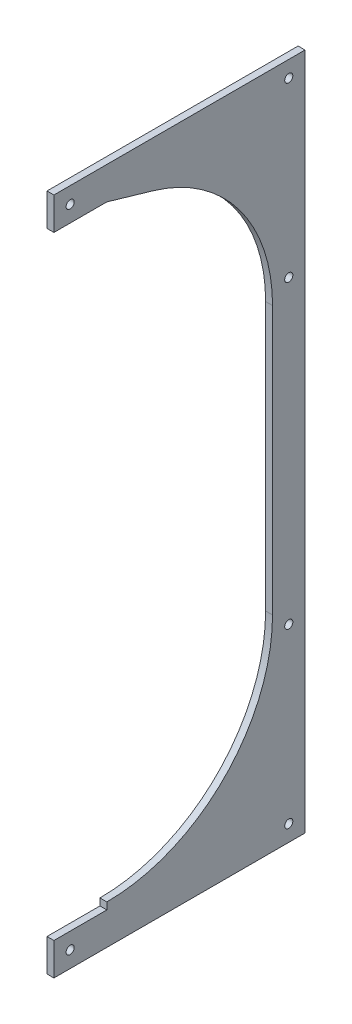
ISO-10303-21;
HEADER;
FILE_DESCRIPTION(('STEP AP214'),'2;1');
FILE_NAME('part.step','',(''),(''),'','','');
FILE_SCHEMA(('AUTOMOTIVE_DESIGN { 1 0 10303 214 1 1 1 1 }'));
ENDSEC;
DATA;
#1=APPLICATION_CONTEXT('core data for automotive mechanical design processes');
#2=APPLICATION_PROTOCOL_DEFINITION('international standard','automotive_design',2000,#1);
#3=PRODUCT_CONTEXT('',#1,'mechanical');
#4=PRODUCT('Part','Part','',(#3));
#5=PRODUCT_RELATED_PRODUCT_CATEGORY('part','',(#4));
#6=PRODUCT_DEFINITION_FORMATION('','',#4);
#7=PRODUCT_DEFINITION_CONTEXT('part definition',#1,'design');
#8=PRODUCT_DEFINITION('design','',#6,#7);
#9=PRODUCT_DEFINITION_SHAPE('','',#8);
#10=(LENGTH_UNIT() NAMED_UNIT(*) SI_UNIT(.MILLI.,.METRE.));
#11=(NAMED_UNIT(*) PLANE_ANGLE_UNIT() SI_UNIT($,.RADIAN.));
#12=(NAMED_UNIT(*) SI_UNIT($,.STERADIAN.) SOLID_ANGLE_UNIT());
#13=UNCERTAINTY_MEASURE_WITH_UNIT(LENGTH_MEASURE(1.E-05),#10,'distance_accuracy_value','');
#14=(GEOMETRIC_REPRESENTATION_CONTEXT(3) GLOBAL_UNCERTAINTY_ASSIGNED_CONTEXT((#13)) GLOBAL_UNIT_ASSIGNED_CONTEXT((#10,
#11,#12)) REPRESENTATION_CONTEXT('',''));
#15=CARTESIAN_POINT('',(0.,0.,0.));
#16=DIRECTION('',(0.,0.,1.));
#17=DIRECTION('',(1.,0.,0.));
#18=AXIS2_PLACEMENT_3D('',#15,#16,#17);
#19=CARTESIAN_POINT('',(5.4102,0.,-154.94));
#20=DIRECTION('',(0.,0.,1.));
#21=DIRECTION('',(1.,0.,0.));
#22=AXIS2_PLACEMENT_3D('',#19,#20,#21);
#23=PLANE('',#22);
#24=DIRECTION('',(0.,1.,0.));
#25=VECTOR('',#24,1.);
#26=CARTESIAN_POINT('',(0.,0.,-154.94));
#27=LINE('',#26,#25);
#28=CARTESIAN_POINT('',(0.,-160.3502,-154.94));
#29=VERTEX_POINT('',#28);
#30=CARTESIAN_POINT('',(0.,369.88496,-154.94));
#31=VERTEX_POINT('',#30);
#32=EDGE_CURVE('E169',#29,#31,#27,.T.);
#33=ORIENTED_EDGE('',*,*,#32,.T.);
#34=DIRECTION('',(-1.,0.,0.));
#35=VECTOR('',#34,1.);
#36=CARTESIAN_POINT('',(5.4102,369.88496,-154.94));
#37=LINE('',#36,#35);
#38=CARTESIAN_POINT('',(5.4102,369.88496,-154.94));
#39=VERTEX_POINT('',#38);
#40=EDGE_CURVE('E11',#39,#31,#37,.T.);
#41=ORIENTED_EDGE('',*,*,#40,.F.);
#42=DIRECTION('',(0.,1.,0.));
#43=VECTOR('',#42,1.);
#44=CARTESIAN_POINT('',(5.4102,0.,-154.94));
#45=LINE('',#44,#43);
#46=CARTESIAN_POINT('',(5.4102,-160.3502,-154.94));
#47=VERTEX_POINT('',#46);
#48=EDGE_CURVE('E97',#47,#39,#45,.T.);
#49=ORIENTED_EDGE('',*,*,#48,.F.);
#50=DIRECTION('',(-1.,0.,0.));
#51=VECTOR('',#50,1.);
#52=CARTESIAN_POINT('',(5.4102,-160.3502,-154.94));
#53=LINE('',#52,#51);
#54=EDGE_CURVE('E168',#47,#29,#53,.T.);
#55=ORIENTED_EDGE('',*,*,#54,.T.);
#56=EDGE_LOOP('',(#33,#41,#49,#55));
#57=FACE_BOUND('',#56,.T.);
#58=ADVANCED_FACE('F35',(#57),#23,.F.);
#59=CARTESIAN_POINT('',(5.4102,369.88496,0.));
#60=DIRECTION('',(0.,1.,0.));
#61=DIRECTION('',(0.,0.,1.));
#62=AXIS2_PLACEMENT_3D('',#59,#60,#61);
#63=PLANE('',#62);
#64=DIRECTION('',(0.,0.,-1.));
#65=VECTOR('',#64,1.);
#66=CARTESIAN_POINT('',(0.,369.88496,0.));
#67=LINE('',#66,#65);
#68=CARTESIAN_POINT('',(0.,369.88496,41.402));
#69=VERTEX_POINT('',#68);
#70=EDGE_CURVE('E172',#69,#31,#67,.T.);
#71=ORIENTED_EDGE('',*,*,#70,.F.);
#72=DIRECTION('',(-1.,0.,0.));
#73=VECTOR('',#72,1.);
#74=CARTESIAN_POINT('',(5.4102,369.88496,41.402));
#75=LINE('',#74,#73);
#76=CARTESIAN_POINT('',(5.4102,369.88496,41.402));
#77=VERTEX_POINT('',#76);
#78=EDGE_CURVE('E43',#77,#69,#75,.T.);
#79=ORIENTED_EDGE('',*,*,#78,.F.);
#80=DIRECTION('',(0.,0.,-1.));
#81=VECTOR('',#80,1.);
#82=CARTESIAN_POINT('',(5.4102,369.88496,0.));
#83=LINE('',#82,#81);
#84=EDGE_CURVE('E244',#77,#39,#83,.T.);
#85=ORIENTED_EDGE('',*,*,#84,.T.);
#86=ORIENTED_EDGE('',*,*,#40,.T.);
#87=EDGE_LOOP('',(#71,#79,#85,#86));
#88=FACE_BOUND('',#87,.T.);
#89=ADVANCED_FACE('F243',(#88),#63,.T.);
#90=CARTESIAN_POINT('',(5.4102,0.,41.402));
#91=DIRECTION('',(0.,0.,-1.));
#92=DIRECTION('',(-1.,0.,0.));
#93=AXIS2_PLACEMENT_3D('',#90,#91,#92);
#94=PLANE('',#93);
#95=DIRECTION('',(0.,-1.,0.));
#96=VECTOR('',#95,1.);
#97=CARTESIAN_POINT('',(0.,0.,41.402));
#98=LINE('',#97,#96);
#99=CARTESIAN_POINT('',(0.,344.48496,41.402));
#100=VERTEX_POINT('',#99);
#101=EDGE_CURVE('E176',#69,#100,#98,.T.);
#102=ORIENTED_EDGE('',*,*,#101,.T.);
#103=DIRECTION('',(-1.,0.,0.));
#104=VECTOR('',#103,1.);
#105=CARTESIAN_POINT('',(5.4102,344.48496,41.402));
#106=LINE('',#105,#104);
#107=CARTESIAN_POINT('',(5.4102,344.48496,41.402));
#108=VERTEX_POINT('',#107);
#109=EDGE_CURVE('E226',#108,#100,#106,.T.);
#110=ORIENTED_EDGE('',*,*,#109,.F.);
#111=DIRECTION('',(0.,-1.,0.));
#112=VECTOR('',#111,1.);
#113=CARTESIAN_POINT('',(5.4102,0.,41.402));
#114=LINE('',#113,#112);
#115=EDGE_CURVE('E232',#77,#108,#114,.T.);
#116=ORIENTED_EDGE('',*,*,#115,.F.);
#117=ORIENTED_EDGE('',*,*,#78,.T.);
#118=EDGE_LOOP('',(#102,#110,#116,#117));
#119=FACE_BOUND('',#118,.T.);
#120=ADVANCED_FACE('F230',(#119),#94,.F.);
#121=CARTESIAN_POINT('',(5.4102,344.48496,0.));
#122=DIRECTION('',(0.,-1.,0.));
#123=DIRECTION('',(0.,0.,-1.));
#124=AXIS2_PLACEMENT_3D('',#121,#122,#123);
#125=PLANE('',#124);
#126=DIRECTION('',(0.,0.,1.));
#127=VECTOR('',#126,1.);
#128=CARTESIAN_POINT('',(0.,344.48496,0.));
#129=LINE('',#128,#127);
#130=CARTESIAN_POINT('',(0.,344.48496,0.));
#131=VERTEX_POINT('',#130);
#132=EDGE_CURVE('E179',#131,#100,#129,.T.);
#133=ORIENTED_EDGE('',*,*,#132,.F.);
#134=DIRECTION('',(-1.,0.,0.));
#135=VECTOR('',#134,1.);
#136=CARTESIAN_POINT('',(5.4102,344.48496,0.));
#137=LINE('',#136,#135);
#138=CARTESIAN_POINT('',(5.4102,344.48496,0.));
#139=VERTEX_POINT('',#138);
#140=EDGE_CURVE('E224',#139,#131,#137,.T.);
#141=ORIENTED_EDGE('',*,*,#140,.F.);
#142=DIRECTION('',(0.,0.,1.));
#143=VECTOR('',#142,1.);
#144=CARTESIAN_POINT('',(5.4102,344.48496,0.));
#145=LINE('',#144,#143);
#146=EDGE_CURVE('E279',#139,#108,#145,.T.);
#147=ORIENTED_EDGE('',*,*,#146,.T.);
#148=ORIENTED_EDGE('',*,*,#109,.T.);
#149=EDGE_LOOP('',(#133,#141,#147,#148));
#150=FACE_BOUND('',#149,.T.);
#151=ADVANCED_FACE('F289',(#150),#125,.T.);
#152=CARTESIAN_POINT('',(5.4102,209.53476,0.));
#153=DIRECTION('',(-1.,0.,0.));
#154=DIRECTION('',(0.,0.,1.));
#155=AXIS2_PLACEMENT_3D('',#152,#153,#154);
#156=CYLINDRICAL_SURFACE('',#155,129.54);
#157=CARTESIAN_POINT('',(5.4102,209.53476,0.));
#158=DIRECTION('',(1.,0.,0.));
#159=DIRECTION('',(0.,0.,-1.));
#160=AXIS2_PLACEMENT_3D('',#157,#158,#159);
#161=CIRCLE('',#160,129.54);
#162=CARTESIAN_POINT('',(5.4102,333.881462825265,-36.3112805679615));
#163=VERTEX_POINT('',#162);
#164=CARTESIAN_POINT('',(5.4102,209.53476,-129.54));
#165=VERTEX_POINT('',#164);
#166=EDGE_CURVE('E268',#163,#165,#161,.F.);
#167=ORIENTED_EDGE('',*,*,#166,.F.);
#168=DIRECTION('',(1.,0.,0.));
#169=VECTOR('',#168,1.);
#170=CARTESIAN_POINT('',(0.,333.881462825265,-36.3112805679615));
#171=LINE('',#170,#169);
#172=CARTESIAN_POINT('',(0.,333.881462825265,-36.3112805679615));
#173=VERTEX_POINT('',#172);
#174=EDGE_CURVE('E173',#173,#163,#171,.T.);
#175=ORIENTED_EDGE('',*,*,#174,.F.);
#176=CARTESIAN_POINT('',(0.,209.53476,0.));
#177=DIRECTION('',(1.,0.,0.));
#178=DIRECTION('',(0.,0.,-1.));
#179=AXIS2_PLACEMENT_3D('',#176,#177,#178);
#180=CIRCLE('',#179,129.54);
#181=CARTESIAN_POINT('',(0.,209.53476,-129.54));
#182=VERTEX_POINT('',#181);
#183=EDGE_CURVE('E182',#173,#182,#180,.F.);
#184=ORIENTED_EDGE('',*,*,#183,.T.);
#185=DIRECTION('',(-1.,0.,0.));
#186=VECTOR('',#185,1.);
#187=CARTESIAN_POINT('',(5.4102,209.53476,-129.54));
#188=LINE('',#187,#186);
#189=EDGE_CURVE('E221',#165,#182,#188,.T.);
#190=ORIENTED_EDGE('',*,*,#189,.F.);
#191=EDGE_LOOP('',(#167,#175,#184,#190));
#192=FACE_BOUND('',#191,.T.);
#193=ADVANCED_FACE('F265',(#192),#156,.F.);
#194=CARTESIAN_POINT('',(5.4102,0.,-129.54));
#195=DIRECTION('',(0.,0.,-1.));
#196=DIRECTION('',(-1.,0.,0.));
#197=AXIS2_PLACEMENT_3D('',#194,#195,#196);
#198=PLANE('',#197);
#199=DIRECTION('',(0.,-1.,0.));
#200=VECTOR('',#199,1.);
#201=CARTESIAN_POINT('',(0.,0.,-129.54));
#202=LINE('',#201,#200);
#203=CARTESIAN_POINT('',(0.,0.,-129.54));
#204=VERTEX_POINT('',#203);
#205=EDGE_CURVE('E184',#182,#204,#202,.T.);
#206=ORIENTED_EDGE('',*,*,#205,.T.);
#207=DIRECTION('',(-1.,0.,0.));
#208=VECTOR('',#207,1.);
#209=CARTESIAN_POINT('',(5.4102,0.,-129.54));
#210=LINE('',#209,#208);
#211=CARTESIAN_POINT('',(5.4102,0.,-129.54));
#212=VERTEX_POINT('',#211);
#213=EDGE_CURVE('E219',#212,#204,#210,.T.);
#214=ORIENTED_EDGE('',*,*,#213,.F.);
#215=DIRECTION('',(0.,-1.,0.));
#216=VECTOR('',#215,1.);
#217=CARTESIAN_POINT('',(5.4102,0.,-129.54));
#218=LINE('',#217,#216);
#219=EDGE_CURVE('E283',#165,#212,#218,.T.);
#220=ORIENTED_EDGE('',*,*,#219,.F.);
#221=ORIENTED_EDGE('',*,*,#189,.T.);
#222=EDGE_LOOP('',(#206,#214,#220,#221));
#223=FACE_BOUND('',#222,.T.);
#224=ADVANCED_FACE('F257',(#223),#198,.F.);
#225=CARTESIAN_POINT('',(5.4102,0.,0.));
#226=DIRECTION('',(-1.,0.,0.));
#227=DIRECTION('',(0.,0.,1.));
#228=AXIS2_PLACEMENT_3D('',#225,#226,#227);
#229=CYLINDRICAL_SURFACE('',#228,129.54);
#230=CARTESIAN_POINT('',(0.,0.,0.));
#231=DIRECTION('',(1.,0.,0.));
#232=DIRECTION('',(0.,0.,-1.));
#233=AXIS2_PLACEMENT_3D('',#230,#231,#232);
#234=CIRCLE('',#233,129.54);
#235=CARTESIAN_POINT('',(0.,-129.54,0.));
#236=VERTEX_POINT('',#235);
#237=EDGE_CURVE('E187',#236,#204,#234,.T.);
#238=ORIENTED_EDGE('',*,*,#237,.F.);
#239=DIRECTION('',(-1.,0.,0.));
#240=VECTOR('',#239,1.);
#241=CARTESIAN_POINT('',(5.4102,-129.54,0.));
#242=LINE('',#241,#240);
#243=CARTESIAN_POINT('',(5.4102,-129.54,0.));
#244=VERTEX_POINT('',#243);
#245=EDGE_CURVE('E217',#244,#236,#242,.T.);
#246=ORIENTED_EDGE('',*,*,#245,.F.);
#247=CARTESIAN_POINT('',(5.4102,0.,0.));
#248=DIRECTION('',(1.,0.,0.));
#249=DIRECTION('',(0.,0.,-1.));
#250=AXIS2_PLACEMENT_3D('',#247,#248,#249);
#251=CIRCLE('',#250,129.54);
#252=EDGE_CURVE('E254',#244,#212,#251,.T.);
#253=ORIENTED_EDGE('',*,*,#252,.T.);
#254=ORIENTED_EDGE('',*,*,#213,.T.);
#255=EDGE_LOOP('',(#238,#246,#253,#254));
#256=FACE_BOUND('',#255,.T.);
#257=ADVANCED_FACE('F251',(#256),#229,.F.);
#258=CARTESIAN_POINT('',(5.4102,0.,0.));
#259=DIRECTION('',(0.,0.,-1.));
#260=DIRECTION('',(0.,1.,0.));
#261=AXIS2_PLACEMENT_3D('',#258,#259,#260);
#262=PLANE('',#261);
#263=DIRECTION('',(0.,-1.,0.));
#264=VECTOR('',#263,1.);
#265=CARTESIAN_POINT('',(0.,0.,0.));
#266=LINE('',#265,#264);
#267=CARTESIAN_POINT('',(0.,-134.9502,0.));
#268=VERTEX_POINT('',#267);
#269=EDGE_CURVE('E190',#236,#268,#266,.T.);
#270=ORIENTED_EDGE('',*,*,#269,.T.);
#271=DIRECTION('',(-1.,0.,0.));
#272=VECTOR('',#271,1.);
#273=CARTESIAN_POINT('',(5.4102,-134.9502,0.));
#274=LINE('',#273,#272);
#275=CARTESIAN_POINT('',(5.4102,-134.9502,0.));
#276=VERTEX_POINT('',#275);
#277=EDGE_CURVE('E143',#276,#268,#274,.T.);
#278=ORIENTED_EDGE('',*,*,#277,.F.);
#279=DIRECTION('',(0.,-1.,0.));
#280=VECTOR('',#279,1.);
#281=CARTESIAN_POINT('',(5.4102,0.,0.));
#282=LINE('',#281,#280);
#283=EDGE_CURVE('E130',#244,#276,#282,.T.);
#284=ORIENTED_EDGE('',*,*,#283,.F.);
#285=ORIENTED_EDGE('',*,*,#245,.T.);
#286=EDGE_LOOP('',(#270,#278,#284,#285));
#287=FACE_BOUND('',#286,.T.);
#288=ADVANCED_FACE('F327',(#287),#262,.F.);
#289=CARTESIAN_POINT('',(5.4102,-134.9502,0.));
#290=DIRECTION('',(0.,-1.,0.));
#291=DIRECTION('',(0.,0.,-1.));
#292=AXIS2_PLACEMENT_3D('',#289,#290,#291);
#293=PLANE('',#292);
#294=DIRECTION('',(0.,0.,1.));
#295=VECTOR('',#294,1.);
#296=CARTESIAN_POINT('',(0.,-134.9502,0.));
#297=LINE('',#296,#295);
#298=CARTESIAN_POINT('',(0.,-134.9502,41.402));
#299=VERTEX_POINT('',#298);
#300=EDGE_CURVE('E139',#268,#299,#297,.T.);
#301=ORIENTED_EDGE('',*,*,#300,.T.);
#302=DIRECTION('',(-1.,0.,0.));
#303=VECTOR('',#302,1.);
#304=CARTESIAN_POINT('',(5.4102,-134.9502,41.402));
#305=LINE('',#304,#303);
#306=CARTESIAN_POINT('',(5.4102,-134.9502,41.402));
#307=VERTEX_POINT('',#306);
#308=EDGE_CURVE('E136',#307,#299,#305,.T.);
#309=ORIENTED_EDGE('',*,*,#308,.F.);
#310=DIRECTION('',(0.,0.,1.));
#311=VECTOR('',#310,1.);
#312=CARTESIAN_POINT('',(5.4102,-134.9502,0.));
#313=LINE('',#312,#311);
#314=EDGE_CURVE('E121',#276,#307,#313,.T.);
#315=ORIENTED_EDGE('',*,*,#314,.F.);
#316=ORIENTED_EDGE('',*,*,#277,.T.);
#317=EDGE_LOOP('',(#301,#309,#315,#316));
#318=FACE_BOUND('',#317,.T.);
#319=ADVANCED_FACE('F137',(#318),#293,.F.);
#320=CARTESIAN_POINT('',(5.4102,0.,41.402));
#321=DIRECTION('',(0.,0.,1.));
#322=DIRECTION('',(1.,0.,0.));
#323=AXIS2_PLACEMENT_3D('',#320,#321,#322);
#324=PLANE('',#323);
#325=DIRECTION('',(0.,1.,0.));
#326=VECTOR('',#325,1.);
#327=CARTESIAN_POINT('',(0.,0.,41.402));
#328=LINE('',#327,#326);
#329=CARTESIAN_POINT('',(0.,-160.3502,41.402));
#330=VERTEX_POINT('',#329);
#331=EDGE_CURVE('E193',#330,#299,#328,.T.);
#332=ORIENTED_EDGE('',*,*,#331,.F.);
#333=DIRECTION('',(-1.,0.,0.));
#334=VECTOR('',#333,1.);
#335=CARTESIAN_POINT('',(5.4102,-160.3502,41.402));
#336=LINE('',#335,#334);
#337=CARTESIAN_POINT('',(5.4102,-160.3502,41.402));
#338=VERTEX_POINT('',#337);
#339=EDGE_CURVE('E88',#338,#330,#336,.T.);
#340=ORIENTED_EDGE('',*,*,#339,.F.);
#341=DIRECTION('',(0.,1.,0.));
#342=VECTOR('',#341,1.);
#343=CARTESIAN_POINT('',(5.4102,0.,41.402));
#344=LINE('',#343,#342);
#345=EDGE_CURVE('E127',#338,#307,#344,.T.);
#346=ORIENTED_EDGE('',*,*,#345,.T.);
#347=ORIENTED_EDGE('',*,*,#308,.T.);
#348=EDGE_LOOP('',(#332,#340,#346,#347));
#349=FACE_BOUND('',#348,.T.);
#350=ADVANCED_FACE('F145',(#349),#324,.T.);
#351=CARTESIAN_POINT('',(5.4102,357.18496,28.702));
#352=DIRECTION('',(-1.,0.,0.));
#353=DIRECTION('',(0.,0.,1.));
#354=AXIS2_PLACEMENT_3D('',#351,#352,#353);
#355=CYLINDRICAL_SURFACE('',#354,3.17500000000002);
#356=CARTESIAN_POINT('',(5.4102,357.18496,28.702));
#357=DIRECTION('',(1.,0.,0.));
#358=DIRECTION('',(0.,0.,-1.));
#359=AXIS2_PLACEMENT_3D('',#356,#357,#358);
#360=CIRCLE('',#359,3.17500000000002);
#361=CARTESIAN_POINT('',(5.4102,357.18496,25.527));
#362=VERTEX_POINT('',#361);
#363=EDGE_CURVE('E162',#362,#362,#360,.F.);
#364=ORIENTED_EDGE('',*,*,#363,.F.);
#365=EDGE_LOOP('',(#364));
#366=FACE_BOUND('',#365,.T.);
#367=CARTESIAN_POINT('',(0.,357.18496,28.702));
#368=DIRECTION('',(1.,0.,0.));
#369=DIRECTION('',(0.,0.,-1.));
#370=AXIS2_PLACEMENT_3D('',#367,#368,#369);
#371=CIRCLE('',#370,3.17500000000002);
#372=CARTESIAN_POINT('',(0.,357.18496,25.527));
#373=VERTEX_POINT('',#372);
#374=EDGE_CURVE('E208',#373,#373,#371,.F.);
#375=ORIENTED_EDGE('',*,*,#374,.T.);
#376=EDGE_LOOP('',(#375));
#377=FACE_BOUND('',#376,.T.);
#378=ADVANCED_FACE('F354',(#366,#377),#355,.F.);
#379=CARTESIAN_POINT('',(5.4102,-12.7,-142.24));
#380=DIRECTION('',(-1.,0.,0.));
#381=DIRECTION('',(0.,0.,1.));
#382=AXIS2_PLACEMENT_3D('',#379,#380,#381);
#383=CYLINDRICAL_SURFACE('',#382,3.175);
#384=CARTESIAN_POINT('',(5.4102,-12.7,-142.24));
#385=DIRECTION('',(1.,0.,0.));
#386=DIRECTION('',(0.,0.,-1.));
#387=AXIS2_PLACEMENT_3D('',#384,#385,#386);
#388=CIRCLE('',#387,3.175);
#389=CARTESIAN_POINT('',(5.4102,-12.7,-145.415));
#390=VERTEX_POINT('',#389);
#391=EDGE_CURVE('E159',#390,#390,#388,.T.);
#392=ORIENTED_EDGE('',*,*,#391,.T.);
#393=EDGE_LOOP('',(#392));
#394=FACE_BOUND('',#393,.T.);
#395=CARTESIAN_POINT('',(0.,-12.7,-142.24));
#396=DIRECTION('',(1.,0.,0.));
#397=DIRECTION('',(0.,0.,-1.));
#398=AXIS2_PLACEMENT_3D('',#395,#396,#397);
#399=CIRCLE('',#398,3.175);
#400=CARTESIAN_POINT('',(0.,-12.7,-145.415));
#401=VERTEX_POINT('',#400);
#402=EDGE_CURVE('E205',#401,#401,#399,.T.);
#403=ORIENTED_EDGE('',*,*,#402,.F.);
#404=EDGE_LOOP('',(#403));
#405=FACE_BOUND('',#404,.T.);
#406=ADVANCED_FACE('F363',(#394,#405),#383,.F.);
#407=CARTESIAN_POINT('',(5.4102,-147.6502,-142.24));
#408=DIRECTION('',(-1.,0.,0.));
#409=DIRECTION('',(0.,0.,1.));
#410=AXIS2_PLACEMENT_3D('',#407,#408,#409);
#411=CYLINDRICAL_SURFACE('',#410,3.175);
#412=CARTESIAN_POINT('',(5.4102,-147.6502,-142.24));
#413=DIRECTION('',(1.,0.,0.));
#414=DIRECTION('',(0.,0.,-1.));
#415=AXIS2_PLACEMENT_3D('',#412,#413,#414);
#416=CIRCLE('',#415,3.175);
#417=CARTESIAN_POINT('',(5.4102,-147.6502,-145.415));
#418=VERTEX_POINT('',#417);
#419=EDGE_CURVE('E156',#418,#418,#416,.T.);
#420=ORIENTED_EDGE('',*,*,#419,.T.);
#421=EDGE_LOOP('',(#420));
#422=FACE_BOUND('',#421,.T.);
#423=CARTESIAN_POINT('',(0.,-147.6502,-142.24));
#424=DIRECTION('',(1.,0.,0.));
#425=DIRECTION('',(0.,0.,-1.));
#426=AXIS2_PLACEMENT_3D('',#423,#424,#425);
#427=CIRCLE('',#426,3.175);
#428=CARTESIAN_POINT('',(0.,-147.6502,-145.415));
#429=VERTEX_POINT('',#428);
#430=EDGE_CURVE('E202',#429,#429,#427,.T.);
#431=ORIENTED_EDGE('',*,*,#430,.F.);
#432=EDGE_LOOP('',(#431));
#433=FACE_BOUND('',#432,.T.);
#434=ADVANCED_FACE('F373',(#422,#433),#411,.F.);
#435=CARTESIAN_POINT('',(5.4102,222.23476,-142.24));
#436=DIRECTION('',(-1.,0.,0.));
#437=DIRECTION('',(0.,0.,1.));
#438=AXIS2_PLACEMENT_3D('',#435,#436,#437);
#439=CYLINDRICAL_SURFACE('',#438,3.175);
#440=CARTESIAN_POINT('',(5.4102,222.23476,-142.24));
#441=DIRECTION('',(1.,0.,0.));
#442=DIRECTION('',(0.,0.,-1.));
#443=AXIS2_PLACEMENT_3D('',#440,#441,#442);
#444=CIRCLE('',#443,3.175);
#445=CARTESIAN_POINT('',(5.4102,222.23476,-145.415));
#446=VERTEX_POINT('',#445);
#447=EDGE_CURVE('E153',#446,#446,#444,.F.);
#448=ORIENTED_EDGE('',*,*,#447,.F.);
#449=EDGE_LOOP('',(#448));
#450=FACE_BOUND('',#449,.T.);
#451=CARTESIAN_POINT('',(0.,222.23476,-142.24));
#452=DIRECTION('',(1.,0.,0.));
#453=DIRECTION('',(0.,0.,-1.));
#454=AXIS2_PLACEMENT_3D('',#451,#452,#453);
#455=CIRCLE('',#454,3.175);
#456=CARTESIAN_POINT('',(0.,222.23476,-145.415));
#457=VERTEX_POINT('',#456);
#458=EDGE_CURVE('E199',#457,#457,#455,.F.);
#459=ORIENTED_EDGE('',*,*,#458,.T.);
#460=EDGE_LOOP('',(#459));
#461=FACE_BOUND('',#460,.T.);
#462=ADVANCED_FACE('F383',(#450,#461),#439,.F.);
#463=CARTESIAN_POINT('',(5.4102,357.18496,-142.24));
#464=DIRECTION('',(-1.,0.,0.));
#465=DIRECTION('',(0.,0.,1.));
#466=AXIS2_PLACEMENT_3D('',#463,#464,#465);
#467=CYLINDRICAL_SURFACE('',#466,3.175);
#468=CARTESIAN_POINT('',(5.4102,357.18496,-142.24));
#469=DIRECTION('',(1.,0.,0.));
#470=DIRECTION('',(0.,0.,-1.));
#471=AXIS2_PLACEMENT_3D('',#468,#469,#470);
#472=CIRCLE('',#471,3.175);
#473=CARTESIAN_POINT('',(5.4102,357.18496,-145.415));
#474=VERTEX_POINT('',#473);
#475=EDGE_CURVE('E147',#474,#474,#472,.F.);
#476=ORIENTED_EDGE('',*,*,#475,.F.);
#477=EDGE_LOOP('',(#476));
#478=FACE_BOUND('',#477,.T.);
#479=CARTESIAN_POINT('',(0.,357.18496,-142.24));
#480=DIRECTION('',(1.,0.,0.));
#481=DIRECTION('',(0.,0.,-1.));
#482=AXIS2_PLACEMENT_3D('',#479,#480,#481);
#483=CIRCLE('',#482,3.175);
#484=CARTESIAN_POINT('',(0.,357.18496,-145.415));
#485=VERTEX_POINT('',#484);
#486=EDGE_CURVE('E196',#485,#485,#483,.F.);
#487=ORIENTED_EDGE('',*,*,#486,.T.);
#488=EDGE_LOOP('',(#487));
#489=FACE_BOUND('',#488,.T.);
#490=ADVANCED_FACE('F393',(#478,#489),#467,.F.);
#491=CARTESIAN_POINT('',(5.4102,-160.3502,0.));
#492=DIRECTION('',(0.,1.,0.));
#493=DIRECTION('',(0.,0.,1.));
#494=AXIS2_PLACEMENT_3D('',#491,#492,#493);
#495=PLANE('',#494);
#496=DIRECTION('',(0.,0.,-1.));
#497=VECTOR('',#496,1.);
#498=CARTESIAN_POINT('',(0.,-160.3502,0.));
#499=LINE('',#498,#497);
#500=EDGE_CURVE('E91',#330,#29,#499,.T.);
#501=ORIENTED_EDGE('',*,*,#500,.T.);
#502=ORIENTED_EDGE('',*,*,#54,.F.);
#503=DIRECTION('',(0.,0.,-1.));
#504=VECTOR('',#503,1.);
#505=CARTESIAN_POINT('',(5.4102,-160.3502,0.));
#506=LINE('',#505,#504);
#507=EDGE_CURVE('E51',#338,#47,#506,.T.);
#508=ORIENTED_EDGE('',*,*,#507,.F.);
#509=ORIENTED_EDGE('',*,*,#339,.T.);
#510=EDGE_LOOP('',(#501,#502,#508,#509));
#511=FACE_BOUND('',#510,.T.);
#512=ADVANCED_FACE('F403',(#511),#495,.F.);
#513=CARTESIAN_POINT('',(5.4102,-147.6502,28.702));
#514=DIRECTION('',(-1.,0.,0.));
#515=DIRECTION('',(0.,0.,1.));
#516=AXIS2_PLACEMENT_3D('',#513,#514,#515);
#517=CYLINDRICAL_SURFACE('',#516,3.175);
#518=CARTESIAN_POINT('',(5.4102,-147.6502,28.702));
#519=DIRECTION('',(1.,0.,0.));
#520=DIRECTION('',(0.,0.,-1.));
#521=AXIS2_PLACEMENT_3D('',#518,#519,#520);
#522=CIRCLE('',#521,3.175);
#523=CARTESIAN_POINT('',(5.4102,-147.6502,25.527));
#524=VERTEX_POINT('',#523);
#525=EDGE_CURVE('E165',#524,#524,#522,.T.);
#526=ORIENTED_EDGE('',*,*,#525,.T.);
#527=EDGE_LOOP('',(#526));
#528=FACE_BOUND('',#527,.T.);
#529=CARTESIAN_POINT('',(0.,-147.6502,28.702));
#530=DIRECTION('',(1.,0.,0.));
#531=DIRECTION('',(0.,0.,-1.));
#532=AXIS2_PLACEMENT_3D('',#529,#530,#531);
#533=CIRCLE('',#532,3.175);
#534=CARTESIAN_POINT('',(0.,-147.6502,25.527));
#535=VERTEX_POINT('',#534);
#536=EDGE_CURVE('E211',#535,#535,#533,.T.);
#537=ORIENTED_EDGE('',*,*,#536,.F.);
#538=EDGE_LOOP('',(#537));
#539=FACE_BOUND('',#538,.T.);
#540=ADVANCED_FACE('F414',(#528,#539),#517,.F.);
#541=CARTESIAN_POINT('',(5.4102,0.,0.));
#542=DIRECTION('',(1.,0.,0.));
#543=DIRECTION('',(0.,0.,-1.));
#544=AXIS2_PLACEMENT_3D('',#541,#542,#543);
#545=PLANE('',#544);
#546=DIRECTION('',(0.,0.280309566656573,0.959909655561816));
#547=VECTOR('',#546,1.);
#548=CARTESIAN_POINT('',(5.4102,344.48496,0.));
#549=LINE('',#548,#547);
#550=EDGE_CURVE('E272',#163,#139,#549,.T.);
#551=ORIENTED_EDGE('',*,*,#550,.F.);
#552=ORIENTED_EDGE('',*,*,#166,.T.);
#553=ORIENTED_EDGE('',*,*,#219,.T.);
#554=ORIENTED_EDGE('',*,*,#252,.F.);
#555=ORIENTED_EDGE('',*,*,#283,.T.);
#556=ORIENTED_EDGE('',*,*,#314,.T.);
#557=ORIENTED_EDGE('',*,*,#345,.F.);
#558=ORIENTED_EDGE('',*,*,#507,.T.);
#559=ORIENTED_EDGE('',*,*,#48,.T.);
#560=ORIENTED_EDGE('',*,*,#84,.F.);
#561=ORIENTED_EDGE('',*,*,#115,.T.);
#562=ORIENTED_EDGE('',*,*,#146,.F.);
#563=EDGE_LOOP('',(#551,#552,#553,#554,#555,#556,#557,#558,#559,#560,#561,#562));
#564=FACE_BOUND('',#563,.T.);
#565=ORIENTED_EDGE('',*,*,#475,.T.);
#566=EDGE_LOOP('',(#565));
#567=FACE_BOUND('',#566,.T.);
#568=ORIENTED_EDGE('',*,*,#447,.T.);
#569=EDGE_LOOP('',(#568));
#570=FACE_BOUND('',#569,.T.);
#571=ORIENTED_EDGE('',*,*,#419,.F.);
#572=EDGE_LOOP('',(#571));
#573=FACE_BOUND('',#572,.T.);
#574=ORIENTED_EDGE('',*,*,#391,.F.);
#575=EDGE_LOOP('',(#574));
#576=FACE_BOUND('',#575,.T.);
#577=ORIENTED_EDGE('',*,*,#363,.T.);
#578=EDGE_LOOP('',(#577));
#579=FACE_BOUND('',#578,.T.);
#580=ORIENTED_EDGE('',*,*,#525,.F.);
#581=EDGE_LOOP('',(#580));
#582=FACE_BOUND('',#581,.T.);
#583=ADVANCED_FACE('F124',(#564,#567,#570,#573,#576,#579,#582),#545,.T.);
#584=CARTESIAN_POINT('',(0.,0.,0.));
#585=DIRECTION('',(1.,0.,0.));
#586=DIRECTION('',(0.,0.,-1.));
#587=AXIS2_PLACEMENT_3D('',#584,#585,#586);
#588=PLANE('',#587);
#589=ORIENTED_EDGE('',*,*,#183,.F.);
#590=DIRECTION('',(0.,0.280309566656573,0.959909655561816));
#591=VECTOR('',#590,1.);
#592=CARTESIAN_POINT('',(0.,344.48496,0.));
#593=LINE('',#592,#591);
#594=EDGE_CURVE('E260',#173,#131,#593,.T.);
#595=ORIENTED_EDGE('',*,*,#594,.T.);
#596=ORIENTED_EDGE('',*,*,#132,.T.);
#597=ORIENTED_EDGE('',*,*,#101,.F.);
#598=ORIENTED_EDGE('',*,*,#70,.T.);
#599=ORIENTED_EDGE('',*,*,#32,.F.);
#600=ORIENTED_EDGE('',*,*,#500,.F.);
#601=ORIENTED_EDGE('',*,*,#331,.T.);
#602=ORIENTED_EDGE('',*,*,#300,.F.);
#603=ORIENTED_EDGE('',*,*,#269,.F.);
#604=ORIENTED_EDGE('',*,*,#237,.T.);
#605=ORIENTED_EDGE('',*,*,#205,.F.);
#606=EDGE_LOOP('',(#589,#595,#596,#597,#598,#599,#600,#601,#602,#603,#604,#605));
#607=FACE_BOUND('',#606,.T.);
#608=ORIENTED_EDGE('',*,*,#486,.F.);
#609=EDGE_LOOP('',(#608));
#610=FACE_BOUND('',#609,.T.);
#611=ORIENTED_EDGE('',*,*,#458,.F.);
#612=EDGE_LOOP('',(#611));
#613=FACE_BOUND('',#612,.T.);
#614=ORIENTED_EDGE('',*,*,#430,.T.);
#615=EDGE_LOOP('',(#614));
#616=FACE_BOUND('',#615,.T.);
#617=ORIENTED_EDGE('',*,*,#402,.T.);
#618=EDGE_LOOP('',(#617));
#619=FACE_BOUND('',#618,.T.);
#620=ORIENTED_EDGE('',*,*,#374,.F.);
#621=EDGE_LOOP('',(#620));
#622=FACE_BOUND('',#621,.T.);
#623=ORIENTED_EDGE('',*,*,#536,.T.);
#624=EDGE_LOOP('',(#623));
#625=FACE_BOUND('',#624,.T.);
#626=ADVANCED_FACE('F238',(#607,#610,#613,#616,#619,#622,#625),#588,.F.);
#627=CARTESIAN_POINT('',(0.,344.48496,0.));
#628=DIRECTION('',(0.,0.959909655561816,-0.280309566656573));
#629=DIRECTION('',(0.,0.280309566656573,0.959909655561816));
#630=AXIS2_PLACEMENT_3D('',#627,#628,#629);
#631=PLANE('',#630);
#632=ORIENTED_EDGE('',*,*,#550,.T.);
#633=ORIENTED_EDGE('',*,*,#140,.T.);
#634=ORIENTED_EDGE('',*,*,#594,.F.);
#635=ORIENTED_EDGE('',*,*,#174,.T.);
#636=EDGE_LOOP('',(#632,#633,#634,#635));
#637=FACE_BOUND('',#636,.T.);
#638=ADVANCED_FACE('F287',(#637),#631,.F.);
#639=CLOSED_SHELL('',(#58,#89,#120,#151,#193,#224,#257,#288,#319,#350,#378,#406,#434,#462,#490,
#512,#540,#583,#626,#638));
#640=MANIFOLD_SOLID_BREP('B2',#639);
#641=ADVANCED_BREP_SHAPE_REPRESENTATION('',(#18,#640),#14);
#642=SHAPE_DEFINITION_REPRESENTATION(#9,#641);
ENDSEC;
END-ISO-10303-21;
